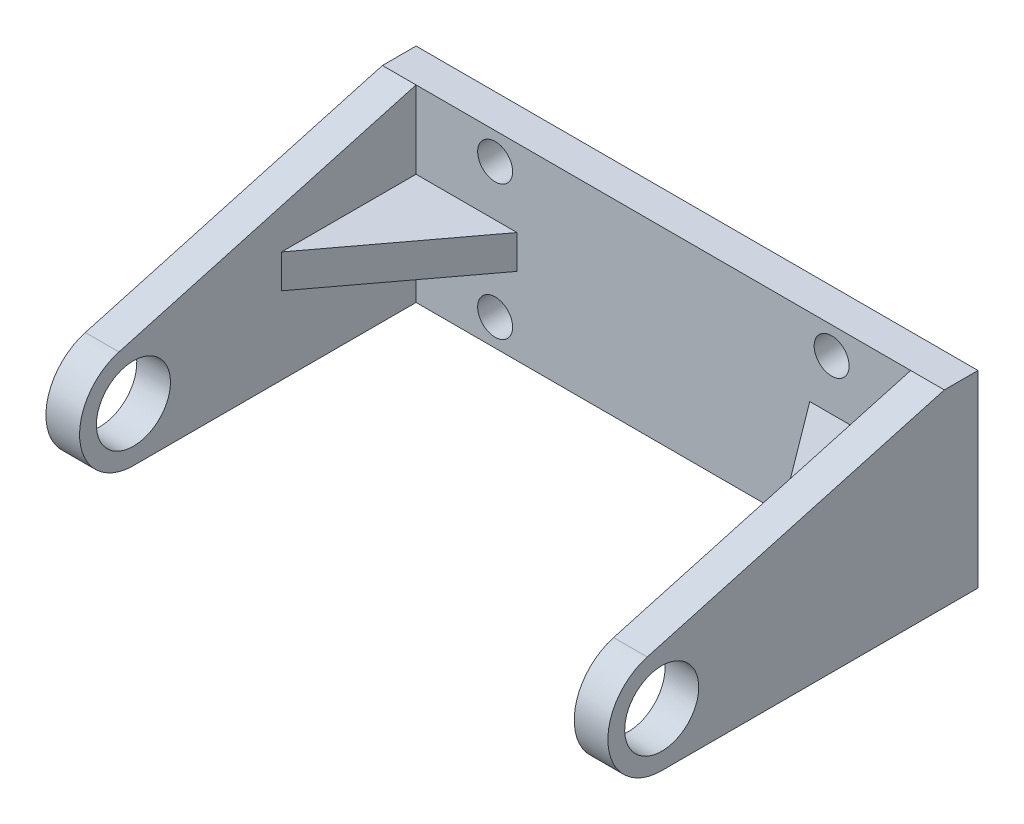
ISO-10303-21;
HEADER;
FILE_DESCRIPTION(('STEP AP214'),'2;1');
FILE_NAME('part.step','',(''),(''),'','','');
FILE_SCHEMA(('AUTOMOTIVE_DESIGN { 1 0 10303 214 1 1 1 1 }'));
ENDSEC;
DATA;
#1=APPLICATION_CONTEXT('core data for automotive mechanical design processes');
#2=APPLICATION_PROTOCOL_DEFINITION('international standard','automotive_design',2000,#1);
#3=PRODUCT_CONTEXT('',#1,'mechanical');
#4=PRODUCT('Part','Part','',(#3));
#5=PRODUCT_RELATED_PRODUCT_CATEGORY('part','',(#4));
#6=PRODUCT_DEFINITION_FORMATION('','',#4);
#7=PRODUCT_DEFINITION_CONTEXT('part definition',#1,'design');
#8=PRODUCT_DEFINITION('design','',#6,#7);
#9=PRODUCT_DEFINITION_SHAPE('','',#8);
#10=(LENGTH_UNIT() NAMED_UNIT(*) SI_UNIT(.MILLI.,.METRE.));
#11=(NAMED_UNIT(*) PLANE_ANGLE_UNIT() SI_UNIT($,.RADIAN.));
#12=(NAMED_UNIT(*) SI_UNIT($,.STERADIAN.) SOLID_ANGLE_UNIT());
#13=UNCERTAINTY_MEASURE_WITH_UNIT(LENGTH_MEASURE(1.E-05),#10,'distance_accuracy_value','');
#14=(GEOMETRIC_REPRESENTATION_CONTEXT(3) GLOBAL_UNCERTAINTY_ASSIGNED_CONTEXT((#13)) GLOBAL_UNIT_ASSIGNED_CONTEXT((#10,
#11,#12)) REPRESENTATION_CONTEXT('',''));
#15=CARTESIAN_POINT('',(0.,0.,0.));
#16=DIRECTION('',(0.,0.,1.));
#17=DIRECTION('',(1.,0.,0.));
#18=AXIS2_PLACEMENT_3D('',#15,#16,#17);
#19=CARTESIAN_POINT('',(0.,0.,5.));
#20=DIRECTION('',(0.,0.,1.));
#21=DIRECTION('',(1.,0.,0.));
#22=AXIS2_PLACEMENT_3D('',#19,#20,#21);
#23=PLANE('',#22);
#24=CARTESIAN_POINT('',(-25.,-10.,5.));
#25=DIRECTION('',(0.,0.,1.));
#26=DIRECTION('',(1.,0.,0.));
#27=AXIS2_PLACEMENT_3D('',#24,#25,#26);
#28=CIRCLE('',#27,2.6);
#29=CARTESIAN_POINT('',(-22.4,-10.,5.));
#30=VERTEX_POINT('',#29);
#31=EDGE_CURVE('E185',#30,#30,#28,.T.);
#32=ORIENTED_EDGE('',*,*,#31,.F.);
#33=EDGE_LOOP('',(#32));
#34=FACE_BOUND('',#33,.T.);
#35=CARTESIAN_POINT('',(25.,-9.99999999999999,5.));
#36=DIRECTION('',(0.,0.,1.));
#37=DIRECTION('',(1.,0.,0.));
#38=AXIS2_PLACEMENT_3D('',#35,#36,#37);
#39=CIRCLE('',#38,2.6);
#40=CARTESIAN_POINT('',(27.6,-9.99999999999999,5.));
#41=VERTEX_POINT('',#40);
#42=EDGE_CURVE('E196',#41,#41,#39,.T.);
#43=ORIENTED_EDGE('',*,*,#42,.F.);
#44=EDGE_LOOP('',(#43));
#45=FACE_BOUND('',#44,.T.);
#46=CARTESIAN_POINT('',(25.,10.,5.));
#47=DIRECTION('',(0.,0.,1.));
#48=DIRECTION('',(1.,0.,0.));
#49=AXIS2_PLACEMENT_3D('',#46,#47,#48);
#50=CIRCLE('',#49,2.6);
#51=CARTESIAN_POINT('',(27.6,10.,5.));
#52=VERTEX_POINT('',#51);
#53=EDGE_CURVE('E190',#52,#52,#50,.T.);
#54=ORIENTED_EDGE('',*,*,#53,.F.);
#55=EDGE_LOOP('',(#54));
#56=FACE_BOUND('',#55,.T.);
#57=CARTESIAN_POINT('',(-25.,10.,5.));
#58=DIRECTION('',(0.,0.,1.));
#59=DIRECTION('',(1.,0.,0.));
#60=AXIS2_PLACEMENT_3D('',#57,#58,#59);
#61=CIRCLE('',#60,2.6);
#62=CARTESIAN_POINT('',(-22.4,10.,5.));
#63=VERTEX_POINT('',#62);
#64=EDGE_CURVE('E189',#63,#63,#61,.T.);
#65=ORIENTED_EDGE('',*,*,#64,.F.);
#66=EDGE_LOOP('',(#65));
#67=FACE_BOUND('',#66,.T.);
#68=DIRECTION('',(0.,-1.,0.));
#69=VECTOR('',#68,1.);
#70=CARTESIAN_POINT('',(21.75,2.5,5.));
#71=LINE('',#70,#69);
#72=CARTESIAN_POINT('',(21.75,2.5,5.));
#73=VERTEX_POINT('',#72);
#74=CARTESIAN_POINT('',(21.75,-2.5,5.));
#75=VERTEX_POINT('',#74);
#76=EDGE_CURVE('E147',#73,#75,#71,.T.);
#77=ORIENTED_EDGE('',*,*,#76,.F.);
#78=DIRECTION('',(-1.,0.,0.));
#79=VECTOR('',#78,1.);
#80=CARTESIAN_POINT('',(21.75,2.5,5.));
#81=LINE('',#80,#79);
#82=CARTESIAN_POINT('',(36.75,2.5,5.));
#83=VERTEX_POINT('',#82);
#84=EDGE_CURVE('E153',#83,#73,#81,.T.);
#85=ORIENTED_EDGE('',*,*,#84,.F.);
#86=DIRECTION('',(0.,1.,0.));
#87=VECTOR('',#86,1.);
#88=CARTESIAN_POINT('',(36.75,-14.,5.));
#89=LINE('',#88,#87);
#90=CARTESIAN_POINT('',(36.75,14.,5.));
#91=VERTEX_POINT('',#90);
#92=EDGE_CURVE('E219',#83,#91,#89,.T.);
#93=ORIENTED_EDGE('',*,*,#92,.T.);
#94=DIRECTION('',(-1.,0.,0.));
#95=VECTOR('',#94,1.);
#96=CARTESIAN_POINT('',(-41.75,14.,5.));
#97=LINE('',#96,#95);
#98=CARTESIAN_POINT('',(-36.75,14.,5.));
#99=VERTEX_POINT('',#98);
#100=EDGE_CURVE('E275',#91,#99,#97,.T.);
#101=ORIENTED_EDGE('',*,*,#100,.T.);
#102=DIRECTION('',(0.,-1.,0.));
#103=VECTOR('',#102,1.);
#104=CARTESIAN_POINT('',(-36.75,14.,5.));
#105=LINE('',#104,#103);
#106=CARTESIAN_POINT('',(-36.75,2.5,5.));
#107=VERTEX_POINT('',#106);
#108=EDGE_CURVE('E250',#99,#107,#105,.T.);
#109=ORIENTED_EDGE('',*,*,#108,.T.);
#110=DIRECTION('',(-1.,0.,0.));
#111=VECTOR('',#110,1.);
#112=CARTESIAN_POINT('',(-36.75,2.5,5.));
#113=LINE('',#112,#111);
#114=CARTESIAN_POINT('',(-21.75,2.5,5.));
#115=VERTEX_POINT('',#114);
#116=EDGE_CURVE('E176',#115,#107,#113,.T.);
#117=ORIENTED_EDGE('',*,*,#116,.F.);
#118=DIRECTION('',(0.,-1.,0.));
#119=VECTOR('',#118,1.);
#120=CARTESIAN_POINT('',(-21.75,2.5,5.));
#121=LINE('',#120,#119);
#122=CARTESIAN_POINT('',(-21.75,-2.5,5.));
#123=VERTEX_POINT('',#122);
#124=EDGE_CURVE('E177',#115,#123,#121,.T.);
#125=ORIENTED_EDGE('',*,*,#124,.T.);
#126=DIRECTION('',(-1.,0.,0.));
#127=VECTOR('',#126,1.);
#128=CARTESIAN_POINT('',(-36.75,-2.5,5.));
#129=LINE('',#128,#127);
#130=CARTESIAN_POINT('',(-36.75,-2.5,5.));
#131=VERTEX_POINT('',#130);
#132=EDGE_CURVE('E174',#123,#131,#129,.T.);
#133=ORIENTED_EDGE('',*,*,#132,.T.);
#134=CARTESIAN_POINT('',(-36.75,-14.,5.));
#135=VERTEX_POINT('',#134);
#136=EDGE_CURVE('E248',#131,#135,#105,.T.);
#137=ORIENTED_EDGE('',*,*,#136,.T.);
#138=DIRECTION('',(1.,0.,0.));
#139=VECTOR('',#138,1.);
#140=CARTESIAN_POINT('',(-41.75,-14.,5.));
#141=LINE('',#140,#139);
#142=CARTESIAN_POINT('',(36.75,-14.,5.));
#143=VERTEX_POINT('',#142);
#144=EDGE_CURVE('E274',#135,#143,#141,.T.);
#145=ORIENTED_EDGE('',*,*,#144,.T.);
#146=CARTESIAN_POINT('',(36.75,-2.5,5.));
#147=VERTEX_POINT('',#146);
#148=EDGE_CURVE('E216',#143,#147,#89,.T.);
#149=ORIENTED_EDGE('',*,*,#148,.T.);
#150=DIRECTION('',(-1.,0.,0.));
#151=VECTOR('',#150,1.);
#152=CARTESIAN_POINT('',(21.75,-2.5,5.));
#153=LINE('',#152,#151);
#154=EDGE_CURVE('E50',#147,#75,#153,.T.);
#155=ORIENTED_EDGE('',*,*,#154,.T.);
#156=EDGE_LOOP('',(#77,#85,#93,#101,#109,#117,#125,#133,#137,#145,#149,#155));
#157=FACE_BOUND('',#156,.T.);
#158=ADVANCED_FACE('F35',(#34,#45,#56,#67,#157),#23,.T.);
#159=CARTESIAN_POINT('',(36.75,-5.99999999999999,47.));
#160=DIRECTION('',(1.,0.,0.));
#161=DIRECTION('',(0.,1.,0.));
#162=AXIS2_PLACEMENT_3D('',#159,#160,#161);
#163=PLANE('',#162);
#164=CARTESIAN_POINT('',(36.75,-5.99999999999999,47.));
#165=DIRECTION('',(1.,0.,0.));
#166=DIRECTION('',(0.,1.,0.));
#167=AXIS2_PLACEMENT_3D('',#164,#165,#166);
#168=CIRCLE('',#167,5.5);
#169=CARTESIAN_POINT('',(36.75,-0.499999999999993,47.));
#170=VERTEX_POINT('',#169);
#171=EDGE_CURVE('E210',#170,#170,#168,.T.);
#172=ORIENTED_EDGE('',*,*,#171,.T.);
#173=EDGE_LOOP('',(#172));
#174=FACE_BOUND('',#173,.T.);
#175=DIRECTION('',(0.,0.,-1.));
#176=VECTOR('',#175,1.);
#177=CARTESIAN_POINT('',(36.75,2.5,5.));
#178=LINE('',#177,#176);
#179=CARTESIAN_POINT('',(36.75,2.5,25.0854594809262));
#180=VERTEX_POINT('',#179);
#181=EDGE_CURVE('E152',#180,#83,#178,.T.);
#182=ORIENTED_EDGE('',*,*,#181,.F.);
#183=DIRECTION('',(0.,-1.,0.));
#184=VECTOR('',#183,1.);
#185=CARTESIAN_POINT('',(36.75,2.5,25.0854594809262));
#186=LINE('',#185,#184);
#187=CARTESIAN_POINT('',(36.75,-2.5,25.0854594809262));
#188=VERTEX_POINT('',#187);
#189=EDGE_CURVE('E149',#180,#188,#186,.T.);
#190=ORIENTED_EDGE('',*,*,#189,.T.);
#191=DIRECTION('',(0.,0.,-1.));
#192=VECTOR('',#191,1.);
#193=CARTESIAN_POINT('',(36.75,-2.5,5.));
#194=LINE('',#193,#192);
#195=EDGE_CURVE('E159',#188,#147,#194,.T.);
#196=ORIENTED_EDGE('',*,*,#195,.T.);
#197=ORIENTED_EDGE('',*,*,#148,.F.);
#198=DIRECTION('',(0.,0.,-1.));
#199=VECTOR('',#198,1.);
#200=CARTESIAN_POINT('',(36.75,-14.,47.));
#201=LINE('',#200,#199);
#202=CARTESIAN_POINT('',(36.75,-14.,47.));
#203=VERTEX_POINT('',#202);
#204=EDGE_CURVE('E225',#203,#143,#201,.T.);
#205=ORIENTED_EDGE('',*,*,#204,.F.);
#206=CARTESIAN_POINT('',(36.75,-5.99999999999999,47.));
#207=DIRECTION('',(1.,0.,0.));
#208=DIRECTION('',(0.,1.,0.));
#209=AXIS2_PLACEMENT_3D('',#206,#207,#208);
#210=CIRCLE('',#209,8.);
#211=CARTESIAN_POINT('',(36.75,1.70677187386859,49.1460818446993));
#212=VERTEX_POINT('',#211);
#213=EDGE_CURVE('E222',#212,#203,#210,.T.);
#214=ORIENTED_EDGE('',*,*,#213,.F.);
#215=DIRECTION('',(0.,-0.268260230587416,0.963346484233573));
#216=VECTOR('',#215,1.);
#217=CARTESIAN_POINT('',(36.75,14.,5.));
#218=LINE('',#217,#216);
#219=EDGE_CURVE('E218',#91,#212,#218,.T.);
#220=ORIENTED_EDGE('',*,*,#219,.F.);
#221=ORIENTED_EDGE('',*,*,#92,.F.);
#222=EDGE_LOOP('',(#182,#190,#196,#197,#205,#214,#220,#221));
#223=FACE_BOUND('',#222,.T.);
#224=ADVANCED_FACE('F317',(#174,#223),#163,.F.);
#225=CARTESIAN_POINT('',(-36.75,-6.,47.));
#226=DIRECTION('',(-1.,0.,0.));
#227=DIRECTION('',(0.,-1.,0.));
#228=AXIS2_PLACEMENT_3D('',#225,#226,#227);
#229=PLANE('',#228);
#230=CARTESIAN_POINT('',(-36.75,-6.,47.));
#231=DIRECTION('',(-1.,0.,0.));
#232=DIRECTION('',(0.,-1.,0.));
#233=AXIS2_PLACEMENT_3D('',#230,#231,#232);
#234=CIRCLE('',#233,5.5);
#235=CARTESIAN_POINT('',(-36.75,-11.5,47.));
#236=VERTEX_POINT('',#235);
#237=EDGE_CURVE('E239',#236,#236,#234,.T.);
#238=ORIENTED_EDGE('',*,*,#237,.T.);
#239=EDGE_LOOP('',(#238));
#240=FACE_BOUND('',#239,.T.);
#241=DIRECTION('',(0.,0.,1.));
#242=VECTOR('',#241,1.);
#243=CARTESIAN_POINT('',(-36.75,2.5,25.));
#244=LINE('',#243,#242);
#245=CARTESIAN_POINT('',(-36.75,2.5,25.));
#246=VERTEX_POINT('',#245);
#247=EDGE_CURVE('E170',#107,#246,#244,.T.);
#248=ORIENTED_EDGE('',*,*,#247,.F.);
#249=ORIENTED_EDGE('',*,*,#108,.F.);
#250=DIRECTION('',(0.,0.268260230587416,-0.963346484233573));
#251=VECTOR('',#250,1.);
#252=CARTESIAN_POINT('',(-36.75,14.,5.));
#253=LINE('',#252,#251);
#254=CARTESIAN_POINT('',(-36.75,1.70677187386858,49.1460818446993));
#255=VERTEX_POINT('',#254);
#256=EDGE_CURVE('E245',#255,#99,#253,.T.);
#257=ORIENTED_EDGE('',*,*,#256,.F.);
#258=CARTESIAN_POINT('',(-36.75,-6.,47.));
#259=DIRECTION('',(-1.,0.,0.));
#260=DIRECTION('',(0.,-1.,0.));
#261=AXIS2_PLACEMENT_3D('',#258,#259,#260);
#262=CIRCLE('',#261,7.99999999999999);
#263=CARTESIAN_POINT('',(-36.75,-14.,47.));
#264=VERTEX_POINT('',#263);
#265=EDGE_CURVE('E256',#264,#255,#262,.T.);
#266=ORIENTED_EDGE('',*,*,#265,.F.);
#267=DIRECTION('',(0.,0.,1.));
#268=VECTOR('',#267,1.);
#269=CARTESIAN_POINT('',(-36.75,-14.,5.));
#270=LINE('',#269,#268);
#271=EDGE_CURVE('E253',#135,#264,#270,.T.);
#272=ORIENTED_EDGE('',*,*,#271,.F.);
#273=ORIENTED_EDGE('',*,*,#136,.F.);
#274=DIRECTION('',(0.,0.,1.));
#275=VECTOR('',#274,1.);
#276=CARTESIAN_POINT('',(-36.75,-2.5,25.));
#277=LINE('',#276,#275);
#278=CARTESIAN_POINT('',(-36.75,-2.5,25.));
#279=VERTEX_POINT('',#278);
#280=EDGE_CURVE('E162',#131,#279,#277,.T.);
#281=ORIENTED_EDGE('',*,*,#280,.T.);
#282=DIRECTION('',(0.,-1.,0.));
#283=VECTOR('',#282,1.);
#284=CARTESIAN_POINT('',(-36.75,2.5,25.));
#285=LINE('',#284,#283);
#286=EDGE_CURVE('E58',#246,#279,#285,.T.);
#287=ORIENTED_EDGE('',*,*,#286,.F.);
#288=EDGE_LOOP('',(#248,#249,#257,#266,#272,#273,#281,#287));
#289=FACE_BOUND('',#288,.T.);
#290=ADVANCED_FACE('F325',(#240,#289),#229,.F.);
#291=CARTESIAN_POINT('',(41.75,14.,5.));
#292=DIRECTION('',(-1.,0.,0.));
#293=DIRECTION('',(0.,0.,1.));
#294=AXIS2_PLACEMENT_3D('',#291,#292,#293);
#295=PLANE('',#294);
#296=DIRECTION('',(0.,1.,0.));
#297=VECTOR('',#296,1.);
#298=CARTESIAN_POINT('',(41.75,14.,0.));
#299=LINE('',#298,#297);
#300=CARTESIAN_POINT('',(41.75,-14.,0.));
#301=VERTEX_POINT('',#300);
#302=CARTESIAN_POINT('',(41.75,14.,0.));
#303=VERTEX_POINT('',#302);
#304=EDGE_CURVE('E266',#301,#303,#299,.T.);
#305=ORIENTED_EDGE('',*,*,#304,.T.);
#306=DIRECTION('',(0.,0.,-1.));
#307=VECTOR('',#306,1.);
#308=CARTESIAN_POINT('',(41.75,14.,5.));
#309=LINE('',#308,#307);
#310=CARTESIAN_POINT('',(41.75,14.,5.));
#311=VERTEX_POINT('',#310);
#312=EDGE_CURVE('E11',#311,#303,#309,.T.);
#313=ORIENTED_EDGE('',*,*,#312,.F.);
#314=DIRECTION('',(0.,-0.268260230587416,0.963346484233573));
#315=VECTOR('',#314,1.);
#316=CARTESIAN_POINT('',(41.75,14.,5.));
#317=LINE('',#316,#315);
#318=CARTESIAN_POINT('',(41.75,1.7067718738686,49.1460818446993));
#319=VERTEX_POINT('',#318);
#320=EDGE_CURVE('E213',#311,#319,#317,.T.);
#321=ORIENTED_EDGE('',*,*,#320,.T.);
#322=CARTESIAN_POINT('',(41.75,-5.99999999999999,47.));
#323=DIRECTION('',(1.,0.,0.));
#324=DIRECTION('',(0.,1.,0.));
#325=AXIS2_PLACEMENT_3D('',#322,#323,#324);
#326=CIRCLE('',#325,8.);
#327=CARTESIAN_POINT('',(41.75,-14.,47.));
#328=VERTEX_POINT('',#327);
#329=EDGE_CURVE('E231',#319,#328,#326,.T.);
#330=ORIENTED_EDGE('',*,*,#329,.T.);
#331=DIRECTION('',(0.,0.,-1.));
#332=VECTOR('',#331,1.);
#333=CARTESIAN_POINT('',(41.75,-14.,5.));
#334=LINE('',#333,#332);
#335=EDGE_CURVE('E277',#328,#301,#334,.T.);
#336=ORIENTED_EDGE('',*,*,#335,.T.);
#337=EDGE_LOOP('',(#305,#313,#321,#330,#336));
#338=FACE_BOUND('',#337,.T.);
#339=CARTESIAN_POINT('',(41.75,-5.99999999999999,47.));
#340=DIRECTION('',(1.,0.,0.));
#341=DIRECTION('',(0.,1.,0.));
#342=AXIS2_PLACEMENT_3D('',#339,#340,#341);
#343=CIRCLE('',#342,5.5);
#344=CARTESIAN_POINT('',(41.75,-0.499999999999992,47.));
#345=VERTEX_POINT('',#344);
#346=EDGE_CURVE('E207',#345,#345,#343,.T.);
#347=ORIENTED_EDGE('',*,*,#346,.F.);
#348=EDGE_LOOP('',(#347));
#349=FACE_BOUND('',#348,.T.);
#350=ADVANCED_FACE('F37',(#338,#349),#295,.F.);
#351=CARTESIAN_POINT('',(-41.75,14.,5.));
#352=DIRECTION('',(0.,-1.,0.));
#353=DIRECTION('',(0.,0.,-1.));
#354=AXIS2_PLACEMENT_3D('',#351,#352,#353);
#355=PLANE('',#354);
#356=DIRECTION('',(-1.,0.,0.));
#357=VECTOR('',#356,1.);
#358=CARTESIAN_POINT('',(-41.75,14.,0.));
#359=LINE('',#358,#357);
#360=CARTESIAN_POINT('',(-41.75,14.,0.));
#361=VERTEX_POINT('',#360);
#362=EDGE_CURVE('E280',#303,#361,#359,.T.);
#363=ORIENTED_EDGE('',*,*,#362,.T.);
#364=DIRECTION('',(0.,0.,-1.));
#365=VECTOR('',#364,1.);
#366=CARTESIAN_POINT('',(-41.75,14.,5.));
#367=LINE('',#366,#365);
#368=CARTESIAN_POINT('',(-41.75,14.,5.));
#369=VERTEX_POINT('',#368);
#370=EDGE_CURVE('E43',#369,#361,#367,.T.);
#371=ORIENTED_EDGE('',*,*,#370,.F.);
#372=DIRECTION('',(-1.,0.,0.));
#373=VECTOR('',#372,1.);
#374=CARTESIAN_POINT('',(-36.75,14.,5.));
#375=LINE('',#374,#373);
#376=EDGE_CURVE('E259',#99,#369,#375,.T.);
#377=ORIENTED_EDGE('',*,*,#376,.F.);
#378=ORIENTED_EDGE('',*,*,#100,.F.);
#379=EDGE_CURVE('E271',#311,#91,#97,.T.);
#380=ORIENTED_EDGE('',*,*,#379,.F.);
#381=ORIENTED_EDGE('',*,*,#312,.T.);
#382=EDGE_LOOP('',(#363,#371,#377,#378,#380,#381));
#383=FACE_BOUND('',#382,.T.);
#384=ADVANCED_FACE('F333',(#383),#355,.F.);
#385=CARTESIAN_POINT('',(-41.75,14.,5.));
#386=DIRECTION('',(1.,0.,0.));
#387=DIRECTION('',(0.,0.,-1.));
#388=AXIS2_PLACEMENT_3D('',#385,#386,#387);
#389=PLANE('',#388);
#390=DIRECTION('',(0.,-1.,0.));
#391=VECTOR('',#390,1.);
#392=CARTESIAN_POINT('',(-41.75,14.,0.));
#393=LINE('',#392,#391);
#394=CARTESIAN_POINT('',(-41.75,-14.,0.));
#395=VERTEX_POINT('',#394);
#396=EDGE_CURVE('E282',#361,#395,#393,.T.);
#397=ORIENTED_EDGE('',*,*,#396,.T.);
#398=DIRECTION('',(0.,0.,-1.));
#399=VECTOR('',#398,1.);
#400=CARTESIAN_POINT('',(-41.75,-14.,5.));
#401=LINE('',#400,#399);
#402=CARTESIAN_POINT('',(-41.75,-14.,47.));
#403=VERTEX_POINT('',#402);
#404=EDGE_CURVE('E288',#403,#395,#401,.T.);
#405=ORIENTED_EDGE('',*,*,#404,.F.);
#406=CARTESIAN_POINT('',(-41.75,-6.,47.));
#407=DIRECTION('',(-1.,0.,0.));
#408=DIRECTION('',(0.,-1.,0.));
#409=AXIS2_PLACEMENT_3D('',#406,#407,#408);
#410=CIRCLE('',#409,7.99999999999999);
#411=CARTESIAN_POINT('',(-41.75,1.70677187386858,49.1460818446993));
#412=VERTEX_POINT('',#411);
#413=EDGE_CURVE('E249',#403,#412,#410,.T.);
#414=ORIENTED_EDGE('',*,*,#413,.T.);
#415=DIRECTION('',(0.,0.268260230587416,-0.963346484233573));
#416=VECTOR('',#415,1.);
#417=CARTESIAN_POINT('',(-41.75,14.,5.));
#418=LINE('',#417,#416);
#419=EDGE_CURVE('E242',#412,#369,#418,.T.);
#420=ORIENTED_EDGE('',*,*,#419,.T.);
#421=ORIENTED_EDGE('',*,*,#370,.T.);
#422=EDGE_LOOP('',(#397,#405,#414,#420,#421));
#423=FACE_BOUND('',#422,.T.);
#424=CARTESIAN_POINT('',(-41.75,-6.,47.));
#425=DIRECTION('',(-1.,0.,0.));
#426=DIRECTION('',(0.,-1.,0.));
#427=AXIS2_PLACEMENT_3D('',#424,#425,#426);
#428=CIRCLE('',#427,5.5);
#429=CARTESIAN_POINT('',(-41.75,-11.5,47.));
#430=VERTEX_POINT('',#429);
#431=EDGE_CURVE('E237',#430,#430,#428,.T.);
#432=ORIENTED_EDGE('',*,*,#431,.F.);
#433=EDGE_LOOP('',(#432));
#434=FACE_BOUND('',#433,.T.);
#435=ADVANCED_FACE('F294',(#423,#434),#389,.F.);
#436=CARTESIAN_POINT('',(-41.75,-14.,5.));
#437=DIRECTION('',(0.,1.,0.));
#438=DIRECTION('',(0.,0.,1.));
#439=AXIS2_PLACEMENT_3D('',#436,#437,#438);
#440=PLANE('',#439);
#441=DIRECTION('',(1.,0.,0.));
#442=VECTOR('',#441,1.);
#443=CARTESIAN_POINT('',(-41.75,-14.,0.));
#444=LINE('',#443,#442);
#445=EDGE_CURVE('E284',#395,#301,#444,.T.);
#446=ORIENTED_EDGE('',*,*,#445,.T.);
#447=ORIENTED_EDGE('',*,*,#335,.F.);
#448=DIRECTION('',(1.,0.,0.));
#449=VECTOR('',#448,1.);
#450=CARTESIAN_POINT('',(36.75,-14.,47.));
#451=LINE('',#450,#449);
#452=EDGE_CURVE('E234',#203,#328,#451,.T.);
#453=ORIENTED_EDGE('',*,*,#452,.F.);
#454=ORIENTED_EDGE('',*,*,#204,.T.);
#455=ORIENTED_EDGE('',*,*,#144,.F.);
#456=ORIENTED_EDGE('',*,*,#271,.T.);
#457=DIRECTION('',(-1.,0.,0.));
#458=VECTOR('',#457,1.);
#459=CARTESIAN_POINT('',(-36.75,-14.,47.));
#460=LINE('',#459,#458);
#461=EDGE_CURVE('E267',#264,#403,#460,.T.);
#462=ORIENTED_EDGE('',*,*,#461,.T.);
#463=ORIENTED_EDGE('',*,*,#404,.T.);
#464=EDGE_LOOP('',(#446,#447,#453,#454,#455,#456,#462,#463));
#465=FACE_BOUND('',#464,.T.);
#466=ADVANCED_FACE('F304',(#465),#440,.F.);
#467=CARTESIAN_POINT('',(0.,0.,0.));
#468=DIRECTION('',(0.,0.,1.));
#469=DIRECTION('',(1.,0.,0.));
#470=AXIS2_PLACEMENT_3D('',#467,#468,#469);
#471=PLANE('',#470);
#472=CARTESIAN_POINT('',(-25.,-10.,0.));
#473=DIRECTION('',(0.,0.,1.));
#474=DIRECTION('',(1.,0.,0.));
#475=AXIS2_PLACEMENT_3D('',#472,#473,#474);
#476=CIRCLE('',#475,2.6);
#477=CARTESIAN_POINT('',(-22.4,-10.,0.));
#478=VERTEX_POINT('',#477);
#479=EDGE_CURVE('E199',#478,#478,#476,.T.);
#480=ORIENTED_EDGE('',*,*,#479,.T.);
#481=EDGE_LOOP('',(#480));
#482=FACE_BOUND('',#481,.T.);
#483=CARTESIAN_POINT('',(25.,-9.99999999999999,0.));
#484=DIRECTION('',(0.,0.,1.));
#485=DIRECTION('',(1.,0.,0.));
#486=AXIS2_PLACEMENT_3D('',#483,#484,#485);
#487=CIRCLE('',#486,2.6);
#488=CARTESIAN_POINT('',(27.6,-9.99999999999999,0.));
#489=VERTEX_POINT('',#488);
#490=EDGE_CURVE('E193',#489,#489,#487,.T.);
#491=ORIENTED_EDGE('',*,*,#490,.T.);
#492=EDGE_LOOP('',(#491));
#493=FACE_BOUND('',#492,.T.);
#494=CARTESIAN_POINT('',(25.,10.,0.));
#495=DIRECTION('',(0.,0.,1.));
#496=DIRECTION('',(1.,0.,0.));
#497=AXIS2_PLACEMENT_3D('',#494,#495,#496);
#498=CIRCLE('',#497,2.6);
#499=CARTESIAN_POINT('',(27.6,10.,0.));
#500=VERTEX_POINT('',#499);
#501=EDGE_CURVE('E186',#500,#500,#498,.T.);
#502=ORIENTED_EDGE('',*,*,#501,.T.);
#503=EDGE_LOOP('',(#502));
#504=FACE_BOUND('',#503,.T.);
#505=CARTESIAN_POINT('',(-25.,10.,0.));
#506=DIRECTION('',(0.,0.,1.));
#507=DIRECTION('',(1.,0.,0.));
#508=AXIS2_PLACEMENT_3D('',#505,#506,#507);
#509=CIRCLE('',#508,2.6);
#510=CARTESIAN_POINT('',(-22.4,10.,0.));
#511=VERTEX_POINT('',#510);
#512=EDGE_CURVE('E204',#511,#511,#509,.T.);
#513=ORIENTED_EDGE('',*,*,#512,.T.);
#514=EDGE_LOOP('',(#513));
#515=FACE_BOUND('',#514,.T.);
#516=ORIENTED_EDGE('',*,*,#304,.F.);
#517=ORIENTED_EDGE('',*,*,#445,.F.);
#518=ORIENTED_EDGE('',*,*,#396,.F.);
#519=ORIENTED_EDGE('',*,*,#362,.F.);
#520=EDGE_LOOP('',(#516,#517,#518,#519));
#521=FACE_BOUND('',#520,.T.);
#522=ADVANCED_FACE('F302',(#482,#493,#504,#515,#521),#471,.F.);
#523=CARTESIAN_POINT('',(-36.75,14.,5.));
#524=DIRECTION('',(0.,0.963346484233573,0.268260230587416));
#525=DIRECTION('',(0.,-0.268260230587416,0.963346484233573));
#526=AXIS2_PLACEMENT_3D('',#523,#524,#525);
#527=PLANE('',#526);
#528=ORIENTED_EDGE('',*,*,#419,.F.);
#529=DIRECTION('',(-1.,0.,0.));
#530=VECTOR('',#529,1.);
#531=CARTESIAN_POINT('',(-36.75,1.70677187386858,49.1460818446993));
#532=LINE('',#531,#530);
#533=EDGE_CURVE('E264',#255,#412,#532,.T.);
#534=ORIENTED_EDGE('',*,*,#533,.F.);
#535=ORIENTED_EDGE('',*,*,#256,.T.);
#536=ORIENTED_EDGE('',*,*,#376,.T.);
#537=EDGE_LOOP('',(#528,#534,#535,#536));
#538=FACE_BOUND('',#537,.T.);
#539=ADVANCED_FACE('F331',(#538),#527,.T.);
#540=CARTESIAN_POINT('',(-36.75,-6.,47.));
#541=DIRECTION('',(-1.,0.,0.));
#542=DIRECTION('',(0.,-1.,0.));
#543=AXIS2_PLACEMENT_3D('',#540,#541,#542);
#544=CYLINDRICAL_SURFACE('',#543,7.99999999999999);
#545=ORIENTED_EDGE('',*,*,#413,.F.);
#546=ORIENTED_EDGE('',*,*,#461,.F.);
#547=ORIENTED_EDGE('',*,*,#265,.T.);
#548=ORIENTED_EDGE('',*,*,#533,.T.);
#549=EDGE_LOOP('',(#545,#546,#547,#548));
#550=FACE_BOUND('',#549,.T.);
#551=ADVANCED_FACE('F329',(#550),#544,.T.);
#552=CARTESIAN_POINT('',(-36.75,-6.,47.));
#553=DIRECTION('',(-1.,0.,0.));
#554=DIRECTION('',(0.,-1.,0.));
#555=AXIS2_PLACEMENT_3D('',#552,#553,#554);
#556=CYLINDRICAL_SURFACE('',#555,5.5);
#557=ORIENTED_EDGE('',*,*,#237,.F.);
#558=EDGE_LOOP('',(#557));
#559=FACE_BOUND('',#558,.T.);
#560=ORIENTED_EDGE('',*,*,#431,.T.);
#561=EDGE_LOOP('',(#560));
#562=FACE_BOUND('',#561,.T.);
#563=ADVANCED_FACE('F380',(#559,#562),#556,.F.);
#564=CARTESIAN_POINT('',(36.75,-5.99999999999999,47.));
#565=DIRECTION('',(1.,0.,0.));
#566=DIRECTION('',(0.,1.,0.));
#567=AXIS2_PLACEMENT_3D('',#564,#565,#566);
#568=CYLINDRICAL_SURFACE('',#567,8.);
#569=ORIENTED_EDGE('',*,*,#329,.F.);
#570=DIRECTION('',(1.,0.,0.));
#571=VECTOR('',#570,1.);
#572=CARTESIAN_POINT('',(36.75,1.70677187386859,49.1460818446993));
#573=LINE('',#572,#571);
#574=EDGE_CURVE('E228',#212,#319,#573,.T.);
#575=ORIENTED_EDGE('',*,*,#574,.F.);
#576=ORIENTED_EDGE('',*,*,#213,.T.);
#577=ORIENTED_EDGE('',*,*,#452,.T.);
#578=EDGE_LOOP('',(#569,#575,#576,#577));
#579=FACE_BOUND('',#578,.T.);
#580=ADVANCED_FACE('F311',(#579),#568,.T.);
#581=CARTESIAN_POINT('',(36.75,14.,5.));
#582=DIRECTION('',(0.,0.963346484233573,0.268260230587416));
#583=DIRECTION('',(0.,-0.268260230587416,0.963346484233573));
#584=AXIS2_PLACEMENT_3D('',#581,#582,#583);
#585=PLANE('',#584);
#586=ORIENTED_EDGE('',*,*,#320,.F.);
#587=ORIENTED_EDGE('',*,*,#379,.T.);
#588=ORIENTED_EDGE('',*,*,#219,.T.);
#589=ORIENTED_EDGE('',*,*,#574,.T.);
#590=EDGE_LOOP('',(#586,#587,#588,#589));
#591=FACE_BOUND('',#590,.T.);
#592=ADVANCED_FACE('F336',(#591),#585,.T.);
#593=CARTESIAN_POINT('',(36.75,-5.99999999999999,47.));
#594=DIRECTION('',(1.,0.,0.));
#595=DIRECTION('',(0.,1.,0.));
#596=AXIS2_PLACEMENT_3D('',#593,#594,#595);
#597=CYLINDRICAL_SURFACE('',#596,5.5);
#598=ORIENTED_EDGE('',*,*,#171,.F.);
#599=EDGE_LOOP('',(#598));
#600=FACE_BOUND('',#599,.T.);
#601=ORIENTED_EDGE('',*,*,#346,.T.);
#602=EDGE_LOOP('',(#601));
#603=FACE_BOUND('',#602,.T.);
#604=ADVANCED_FACE('F454',(#600,#603),#597,.F.);
#605=CARTESIAN_POINT('',(-25.,10.,0.));
#606=DIRECTION('',(0.,0.,1.));
#607=DIRECTION('',(1.,0.,0.));
#608=AXIS2_PLACEMENT_3D('',#605,#606,#607);
#609=CYLINDRICAL_SURFACE('',#608,2.6);
#610=ORIENTED_EDGE('',*,*,#512,.F.);
#611=EDGE_LOOP('',(#610));
#612=FACE_BOUND('',#611,.T.);
#613=ORIENTED_EDGE('',*,*,#64,.T.);
#614=EDGE_LOOP('',(#613));
#615=FACE_BOUND('',#614,.T.);
#616=ADVANCED_FACE('F459',(#612,#615),#609,.F.);
#617=CARTESIAN_POINT('',(25.,10.,0.));
#618=DIRECTION('',(0.,0.,1.));
#619=DIRECTION('',(1.,0.,0.));
#620=AXIS2_PLACEMENT_3D('',#617,#618,#619);
#621=CYLINDRICAL_SURFACE('',#620,2.6);
#622=ORIENTED_EDGE('',*,*,#501,.F.);
#623=EDGE_LOOP('',(#622));
#624=FACE_BOUND('',#623,.T.);
#625=ORIENTED_EDGE('',*,*,#53,.T.);
#626=EDGE_LOOP('',(#625));
#627=FACE_BOUND('',#626,.T.);
#628=ADVANCED_FACE('F466',(#624,#627),#621,.F.);
#629=CARTESIAN_POINT('',(25.,-9.99999999999999,0.));
#630=DIRECTION('',(0.,0.,1.));
#631=DIRECTION('',(1.,0.,0.));
#632=AXIS2_PLACEMENT_3D('',#629,#630,#631);
#633=CYLINDRICAL_SURFACE('',#632,2.6);
#634=ORIENTED_EDGE('',*,*,#490,.F.);
#635=EDGE_LOOP('',(#634));
#636=FACE_BOUND('',#635,.T.);
#637=ORIENTED_EDGE('',*,*,#42,.T.);
#638=EDGE_LOOP('',(#637));
#639=FACE_BOUND('',#638,.T.);
#640=ADVANCED_FACE('F474',(#636,#639),#633,.F.);
#641=CARTESIAN_POINT('',(-25.,-10.,0.));
#642=DIRECTION('',(0.,0.,1.));
#643=DIRECTION('',(1.,0.,0.));
#644=AXIS2_PLACEMENT_3D('',#641,#642,#643);
#645=CYLINDRICAL_SURFACE('',#644,2.6);
#646=ORIENTED_EDGE('',*,*,#479,.F.);
#647=EDGE_LOOP('',(#646));
#648=FACE_BOUND('',#647,.T.);
#649=ORIENTED_EDGE('',*,*,#31,.T.);
#650=EDGE_LOOP('',(#649));
#651=FACE_BOUND('',#650,.T.);
#652=ADVANCED_FACE('F482',(#648,#651),#645,.F.);
#653=CARTESIAN_POINT('',(-21.75,2.5,5.));
#654=DIRECTION('',(-0.8,0.,-0.6));
#655=DIRECTION('',(-0.6,0.,0.8));
#656=AXIS2_PLACEMENT_3D('',#653,#654,#655);
#657=PLANE('',#656);
#658=DIRECTION('',(0.6,0.,-0.8));
#659=VECTOR('',#658,1.);
#660=CARTESIAN_POINT('',(-21.75,-2.5,5.));
#661=LINE('',#660,#659);
#662=EDGE_CURVE('E165',#279,#123,#661,.T.);
#663=ORIENTED_EDGE('',*,*,#662,.T.);
#664=ORIENTED_EDGE('',*,*,#124,.F.);
#665=DIRECTION('',(0.6,0.,-0.8));
#666=VECTOR('',#665,1.);
#667=CARTESIAN_POINT('',(-21.75,2.5,5.));
#668=LINE('',#667,#666);
#669=EDGE_CURVE('E173',#246,#115,#668,.T.);
#670=ORIENTED_EDGE('',*,*,#669,.F.);
#671=ORIENTED_EDGE('',*,*,#286,.T.);
#672=EDGE_LOOP('',(#663,#664,#670,#671));
#673=FACE_BOUND('',#672,.T.);
#674=ADVANCED_FACE('F490',(#673),#657,.F.);
#675=CARTESIAN_POINT('',(0.,2.5,0.));
#676=DIRECTION('',(0.,-1.,0.));
#677=DIRECTION('',(0.,0.,-1.));
#678=AXIS2_PLACEMENT_3D('',#675,#676,#677);
#679=PLANE('',#678);
#680=ORIENTED_EDGE('',*,*,#247,.T.);
#681=ORIENTED_EDGE('',*,*,#669,.T.);
#682=ORIENTED_EDGE('',*,*,#116,.T.);
#683=EDGE_LOOP('',(#680,#681,#682));
#684=FACE_BOUND('',#683,.T.);
#685=ADVANCED_FACE('F498',(#684),#679,.F.);
#686=CARTESIAN_POINT('',(0.,-2.5,0.));
#687=DIRECTION('',(0.,-1.,0.));
#688=DIRECTION('',(0.,0.,-1.));
#689=AXIS2_PLACEMENT_3D('',#686,#687,#688);
#690=PLANE('',#689);
#691=ORIENTED_EDGE('',*,*,#280,.F.);
#692=ORIENTED_EDGE('',*,*,#132,.F.);
#693=ORIENTED_EDGE('',*,*,#662,.F.);
#694=EDGE_LOOP('',(#691,#692,#693));
#695=FACE_BOUND('',#694,.T.);
#696=ADVANCED_FACE('F505',(#695),#690,.T.);
#697=CARTESIAN_POINT('',(36.75,2.5,25.0854594809262));
#698=DIRECTION('',(0.801225584250385,0.,-0.598362401177271));
#699=DIRECTION('',(-0.598362401177271,0.,-0.801225584250385));
#700=AXIS2_PLACEMENT_3D('',#697,#698,#699);
#701=PLANE('',#700);
#702=DIRECTION('',(0.598362401177271,0.,0.801225584250385));
#703=VECTOR('',#702,1.);
#704=CARTESIAN_POINT('',(36.75,-2.5,25.0854594809262));
#705=LINE('',#704,#703);
#706=EDGE_CURVE('E340',#75,#188,#705,.T.);
#707=ORIENTED_EDGE('',*,*,#706,.T.);
#708=ORIENTED_EDGE('',*,*,#189,.F.);
#709=DIRECTION('',(0.598362401177271,0.,0.801225584250385));
#710=VECTOR('',#709,1.);
#711=CARTESIAN_POINT('',(36.75,2.5,25.0854594809262));
#712=LINE('',#711,#710);
#713=EDGE_CURVE('E143',#73,#180,#712,.T.);
#714=ORIENTED_EDGE('',*,*,#713,.F.);
#715=ORIENTED_EDGE('',*,*,#76,.T.);
#716=EDGE_LOOP('',(#707,#708,#714,#715));
#717=FACE_BOUND('',#716,.T.);
#718=ADVANCED_FACE('F145',(#717),#701,.F.);
#719=CARTESIAN_POINT('',(0.,2.5,0.));
#720=DIRECTION('',(0.,-1.,0.));
#721=DIRECTION('',(0.,0.,-1.));
#722=AXIS2_PLACEMENT_3D('',#719,#720,#721);
#723=PLANE('',#722);
#724=ORIENTED_EDGE('',*,*,#84,.T.);
#725=ORIENTED_EDGE('',*,*,#713,.T.);
#726=ORIENTED_EDGE('',*,*,#181,.T.);
#727=EDGE_LOOP('',(#724,#725,#726));
#728=FACE_BOUND('',#727,.T.);
#729=ADVANCED_FACE('F156',(#728),#723,.F.);
#730=CARTESIAN_POINT('',(0.,-2.5,0.));
#731=DIRECTION('',(0.,-1.,0.));
#732=DIRECTION('',(0.,0.,-1.));
#733=AXIS2_PLACEMENT_3D('',#730,#731,#732);
#734=PLANE('',#733);
#735=ORIENTED_EDGE('',*,*,#154,.F.);
#736=ORIENTED_EDGE('',*,*,#195,.F.);
#737=ORIENTED_EDGE('',*,*,#706,.F.);
#738=EDGE_LOOP('',(#735,#736,#737));
#739=FACE_BOUND('',#738,.T.);
#740=ADVANCED_FACE('F341',(#739),#734,.T.);
#741=CLOSED_SHELL('',(#158,#224,#290,#350,#384,#435,#466,#522,#539,#551,#563,#580,#592,#604,
#616,#628,#640,#652,#674,#685,#696,#718,#729,#740));
#742=MANIFOLD_SOLID_BREP('B2',#741);
#743=ADVANCED_BREP_SHAPE_REPRESENTATION('',(#18,#742),#14);
#744=SHAPE_DEFINITION_REPRESENTATION(#9,#743);
ENDSEC;
END-ISO-10303-21;
